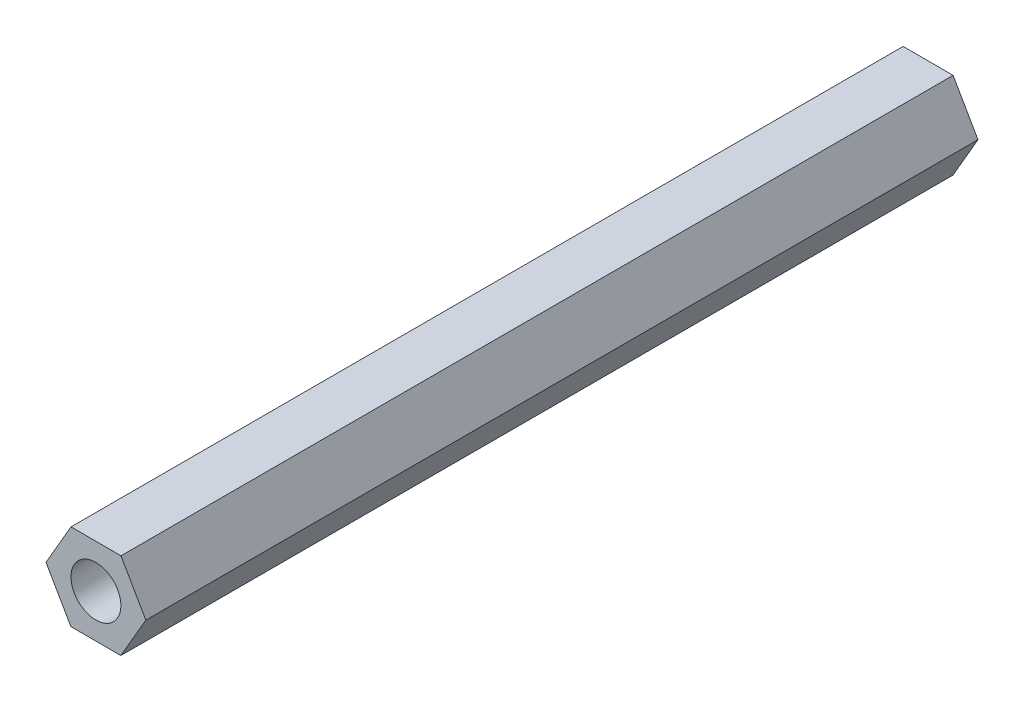
ISO-10303-21;
HEADER;
FILE_DESCRIPTION(('STEP AP214'),'2;1');
FILE_NAME('part.step','',(''),(''),'','','');
FILE_SCHEMA(('AUTOMOTIVE_DESIGN { 1 0 10303 214 1 1 1 1 }'));
ENDSEC;
DATA;
#1=APPLICATION_CONTEXT('core data for automotive mechanical design processes');
#2=APPLICATION_PROTOCOL_DEFINITION('international standard','automotive_design',2000,#1);
#3=PRODUCT_CONTEXT('',#1,'mechanical');
#4=PRODUCT('Part','Part','',(#3));
#5=PRODUCT_RELATED_PRODUCT_CATEGORY('part','',(#4));
#6=PRODUCT_DEFINITION_FORMATION('','',#4);
#7=PRODUCT_DEFINITION_CONTEXT('part definition',#1,'design');
#8=PRODUCT_DEFINITION('design','',#6,#7);
#9=PRODUCT_DEFINITION_SHAPE('','',#8);
#10=(LENGTH_UNIT() NAMED_UNIT(*) SI_UNIT(.MILLI.,.METRE.));
#11=(NAMED_UNIT(*) PLANE_ANGLE_UNIT() SI_UNIT($,.RADIAN.));
#12=(NAMED_UNIT(*) SI_UNIT($,.STERADIAN.) SOLID_ANGLE_UNIT());
#13=UNCERTAINTY_MEASURE_WITH_UNIT(LENGTH_MEASURE(1.E-05),#10,'distance_accuracy_value','');
#14=(GEOMETRIC_REPRESENTATION_CONTEXT(3) GLOBAL_UNCERTAINTY_ASSIGNED_CONTEXT((#13)) GLOBAL_UNIT_ASSIGNED_CONTEXT((#10,
#11,#12)) REPRESENTATION_CONTEXT('',''));
#15=CARTESIAN_POINT('',(0.,0.,0.));
#16=DIRECTION('',(0.,0.,1.));
#17=DIRECTION('',(1.,0.,0.));
#18=AXIS2_PLACEMENT_3D('',#15,#16,#17);
#19=CARTESIAN_POINT('',(2.5,0.,50.));
#20=DIRECTION('',(0.,0.,1.));
#21=DIRECTION('',(1.,0.,0.));
#22=AXIS2_PLACEMENT_3D('',#19,#20,#21);
#23=PLANE('',#22);
#24=CARTESIAN_POINT('',(0.,0.,50.));
#25=DIRECTION('',(0.,0.,-1.));
#26=DIRECTION('',(-1.,0.,0.));
#27=AXIS2_PLACEMENT_3D('',#24,#25,#26);
#28=CIRCLE('',#27,1.5);
#29=CARTESIAN_POINT('',(-1.5,0.,50.));
#30=VERTEX_POINT('',#29);
#31=EDGE_CURVE('E11',#30,#30,#28,.T.);
#32=ORIENTED_EDGE('',*,*,#31,.T.);
#33=EDGE_LOOP('',(#32));
#34=FACE_BOUND('',#33,.T.);
#35=DIRECTION('',(0.999998664474755,-0.00163433433127888,0.));
#36=VECTOR('',#35,1.);
#37=CARTESIAN_POINT('',(-1.49575187156464,2.60052424305387,50.));
#38=LINE('',#37,#36);
#39=CARTESIAN_POINT('',(-1.49575187156464,2.60052424305387,50.));
#40=VERTEX_POINT('',#39);
#41=CARTESIAN_POINT('',(1.50424412185963,2.59562124006003,50.));
#42=VERTEX_POINT('',#41);
#43=EDGE_CURVE('E137',#40,#42,#38,.T.);
#44=ORIENTED_EDGE('',*,*,#43,.F.);
#45=DIRECTION('',(0.501414707286542,0.86520708002001,0.));
#46=VECTOR('',#45,1.);
#47=CARTESIAN_POINT('',(-2.99999599342427,0.00490300299383771,50.));
#48=LINE('',#47,#46);
#49=CARTESIAN_POINT('',(-2.99999599342427,0.00490300299383771,50.));
#50=VERTEX_POINT('',#49);
#51=EDGE_CURVE('E112',#50,#40,#48,.T.);
#52=ORIENTED_EDGE('',*,*,#51,.F.);
#53=DIRECTION('',(-0.498583957188213,0.866841414351289,0.));
#54=VECTOR('',#53,1.);
#55=CARTESIAN_POINT('',(-1.50424412185963,-2.59562124006003,50.));
#56=LINE('',#55,#54);
#57=CARTESIAN_POINT('',(-1.50424412185963,-2.59562124006003,50.));
#58=VERTEX_POINT('',#57);
#59=EDGE_CURVE('E98',#58,#50,#56,.T.);
#60=ORIENTED_EDGE('',*,*,#59,.F.);
#61=DIRECTION('',(-0.999998664474755,0.00163433433127902,0.));
#62=VECTOR('',#61,1.);
#63=CARTESIAN_POINT('',(1.49575187156464,-2.60052424305387,50.));
#64=LINE('',#63,#62);
#65=CARTESIAN_POINT('',(1.49575187156464,-2.60052424305387,50.));
#66=VERTEX_POINT('',#65);
#67=EDGE_CURVE('E110',#66,#58,#64,.T.);
#68=ORIENTED_EDGE('',*,*,#67,.F.);
#69=DIRECTION('',(-0.501414707286542,-0.865207080020009,0.));
#70=VECTOR('',#69,1.);
#71=CARTESIAN_POINT('',(2.99999599342427,-0.00490300299383881,50.));
#72=LINE('',#71,#70);
#73=CARTESIAN_POINT('',(2.99999599342427,-0.00490300299383881,50.));
#74=VERTEX_POINT('',#73);
#75=EDGE_CURVE('E115',#74,#66,#72,.T.);
#76=ORIENTED_EDGE('',*,*,#75,.F.);
#77=DIRECTION('',(0.498583957188213,-0.866841414351289,0.));
#78=VECTOR('',#77,1.);
#79=CARTESIAN_POINT('',(1.50424412185963,2.59562124006003,50.));
#80=LINE('',#79,#78);
#81=EDGE_CURVE('E117',#42,#74,#80,.T.);
#82=ORIENTED_EDGE('',*,*,#81,.F.);
#83=EDGE_LOOP('',(#44,#52,#60,#68,#76,#82));
#84=FACE_BOUND('',#83,.T.);
#85=ADVANCED_FACE('F36',(#34,#84),#23,.T.);
#86=CARTESIAN_POINT('',(0.,0.,50.));
#87=DIRECTION('',(0.,0.,-1.));
#88=DIRECTION('',(-1.,0.,0.));
#89=AXIS2_PLACEMENT_3D('',#86,#87,#88);
#90=CYLINDRICAL_SURFACE('',#89,1.5);
#91=CARTESIAN_POINT('',(0.,0.,0.));
#92=DIRECTION('',(0.,0.,-1.));
#93=DIRECTION('',(-1.,0.,0.));
#94=AXIS2_PLACEMENT_3D('',#91,#92,#93);
#95=CIRCLE('',#94,1.5);
#96=CARTESIAN_POINT('',(-1.5,0.,0.));
#97=VERTEX_POINT('',#96);
#98=EDGE_CURVE('E44',#97,#97,#95,.T.);
#99=ORIENTED_EDGE('',*,*,#98,.T.);
#100=EDGE_LOOP('',(#99));
#101=FACE_BOUND('',#100,.T.);
#102=ORIENTED_EDGE('',*,*,#31,.F.);
#103=EDGE_LOOP('',(#102));
#104=FACE_BOUND('',#103,.T.);
#105=ADVANCED_FACE('F146',(#101,#104),#90,.F.);
#106=CARTESIAN_POINT('',(1.5,0.,0.));
#107=DIRECTION('',(0.,0.,-1.));
#108=DIRECTION('',(-1.,0.,0.));
#109=AXIS2_PLACEMENT_3D('',#106,#107,#108);
#110=PLANE('',#109);
#111=ORIENTED_EDGE('',*,*,#98,.F.);
#112=EDGE_LOOP('',(#111));
#113=FACE_BOUND('',#112,.T.);
#114=DIRECTION('',(0.999998664474755,-0.00163433433127888,0.));
#115=VECTOR('',#114,1.);
#116=CARTESIAN_POINT('',(-1.49575187156464,2.60052424305387,0.));
#117=LINE('',#116,#115);
#118=CARTESIAN_POINT('',(-1.49575187156464,2.60052424305387,0.));
#119=VERTEX_POINT('',#118);
#120=CARTESIAN_POINT('',(1.50424412185963,2.59562124006003,0.));
#121=VERTEX_POINT('',#120);
#122=EDGE_CURVE('E122',#119,#121,#117,.T.);
#123=ORIENTED_EDGE('',*,*,#122,.T.);
#124=DIRECTION('',(0.498583957188213,-0.866841414351289,0.));
#125=VECTOR('',#124,1.);
#126=CARTESIAN_POINT('',(1.50424412185963,2.59562124006003,0.));
#127=LINE('',#126,#125);
#128=CARTESIAN_POINT('',(2.99999599342427,-0.00490300299383881,0.));
#129=VERTEX_POINT('',#128);
#130=EDGE_CURVE('E125',#121,#129,#127,.T.);
#131=ORIENTED_EDGE('',*,*,#130,.T.);
#132=DIRECTION('',(-0.501414707286542,-0.865207080020009,0.));
#133=VECTOR('',#132,1.);
#134=CARTESIAN_POINT('',(2.99999599342427,-0.00490300299383881,0.));
#135=LINE('',#134,#133);
#136=CARTESIAN_POINT('',(1.49575187156464,-2.60052424305387,0.));
#137=VERTEX_POINT('',#136);
#138=EDGE_CURVE('E128',#129,#137,#135,.T.);
#139=ORIENTED_EDGE('',*,*,#138,.T.);
#140=DIRECTION('',(-0.999998664474755,0.00163433433127902,0.));
#141=VECTOR('',#140,1.);
#142=CARTESIAN_POINT('',(1.49575187156464,-2.60052424305387,0.));
#143=LINE('',#142,#141);
#144=CARTESIAN_POINT('',(-1.50424412185963,-2.59562124006003,0.));
#145=VERTEX_POINT('',#144);
#146=EDGE_CURVE('E131',#137,#145,#143,.T.);
#147=ORIENTED_EDGE('',*,*,#146,.T.);
#148=DIRECTION('',(-0.498583957188213,0.866841414351289,0.));
#149=VECTOR('',#148,1.);
#150=CARTESIAN_POINT('',(-1.50424412185963,-2.59562124006003,0.));
#151=LINE('',#150,#149);
#152=CARTESIAN_POINT('',(-2.99999599342427,0.00490300299383771,0.));
#153=VERTEX_POINT('',#152);
#154=EDGE_CURVE('E100',#145,#153,#151,.T.);
#155=ORIENTED_EDGE('',*,*,#154,.T.);
#156=DIRECTION('',(0.501414707286542,0.86520708002001,0.));
#157=VECTOR('',#156,1.);
#158=CARTESIAN_POINT('',(-2.99999599342427,0.00490300299383771,0.));
#159=LINE('',#158,#157);
#160=EDGE_CURVE('E134',#153,#119,#159,.T.);
#161=ORIENTED_EDGE('',*,*,#160,.T.);
#162=EDGE_LOOP('',(#123,#131,#139,#147,#155,#161));
#163=FACE_BOUND('',#162,.T.);
#164=ADVANCED_FACE('F149',(#113,#163),#110,.T.);
#165=CARTESIAN_POINT('',(-1.49575187156464,2.60052424305387,50.));
#166=DIRECTION('',(0.00163433433127888,0.999998664474755,0.));
#167=DIRECTION('',(-0.999998664474755,0.00163433433127888,0.));
#168=AXIS2_PLACEMENT_3D('',#165,#166,#167);
#169=PLANE('',#168);
#170=ORIENTED_EDGE('',*,*,#122,.F.);
#171=DIRECTION('',(0.,0.,-1.));
#172=VECTOR('',#171,1.);
#173=CARTESIAN_POINT('',(-1.49575187156464,2.60052424305387,50.));
#174=LINE('',#173,#172);
#175=EDGE_CURVE('E52',#40,#119,#174,.T.);
#176=ORIENTED_EDGE('',*,*,#175,.F.);
#177=ORIENTED_EDGE('',*,*,#43,.T.);
#178=DIRECTION('',(0.,0.,-1.));
#179=VECTOR('',#178,1.);
#180=CARTESIAN_POINT('',(1.50424412185963,2.59562124006003,50.));
#181=LINE('',#180,#179);
#182=EDGE_CURVE('E87',#42,#121,#181,.T.);
#183=ORIENTED_EDGE('',*,*,#182,.T.);
#184=EDGE_LOOP('',(#170,#176,#177,#183));
#185=FACE_BOUND('',#184,.T.);
#186=ADVANCED_FACE('F152',(#185),#169,.T.);
#187=CARTESIAN_POINT('',(-2.99999599342427,0.00490300299383771,50.));
#188=DIRECTION('',(-0.86520708002001,0.501414707286542,0.));
#189=DIRECTION('',(-0.501414707286542,-0.86520708002001,0.));
#190=AXIS2_PLACEMENT_3D('',#187,#188,#189);
#191=PLANE('',#190);
#192=ORIENTED_EDGE('',*,*,#160,.F.);
#193=DIRECTION('',(0.,0.,-1.));
#194=VECTOR('',#193,1.);
#195=CARTESIAN_POINT('',(-2.99999599342427,0.00490300299383771,50.));
#196=LINE('',#195,#194);
#197=EDGE_CURVE('E75',#50,#153,#196,.T.);
#198=ORIENTED_EDGE('',*,*,#197,.F.);
#199=ORIENTED_EDGE('',*,*,#51,.T.);
#200=ORIENTED_EDGE('',*,*,#175,.T.);
#201=EDGE_LOOP('',(#192,#198,#199,#200));
#202=FACE_BOUND('',#201,.T.);
#203=ADVANCED_FACE('F158',(#202),#191,.T.);
#204=CARTESIAN_POINT('',(-1.50424412185963,-2.59562124006003,50.));
#205=DIRECTION('',(-0.866841414351289,-0.498583957188213,0.));
#206=DIRECTION('',(0.498583957188213,-0.866841414351289,0.));
#207=AXIS2_PLACEMENT_3D('',#204,#205,#206);
#208=PLANE('',#207);
#209=ORIENTED_EDGE('',*,*,#154,.F.);
#210=DIRECTION('',(0.,0.,-1.));
#211=VECTOR('',#210,1.);
#212=CARTESIAN_POINT('',(-1.50424412185963,-2.59562124006003,50.));
#213=LINE('',#212,#211);
#214=EDGE_CURVE('E95',#58,#145,#213,.T.);
#215=ORIENTED_EDGE('',*,*,#214,.F.);
#216=ORIENTED_EDGE('',*,*,#59,.T.);
#217=ORIENTED_EDGE('',*,*,#197,.T.);
#218=EDGE_LOOP('',(#209,#215,#216,#217));
#219=FACE_BOUND('',#218,.T.);
#220=ADVANCED_FACE('F97',(#219),#208,.T.);
#221=CARTESIAN_POINT('',(1.49575187156464,-2.60052424305387,50.));
#222=DIRECTION('',(-0.00163433433127902,-0.999998664474755,0.));
#223=DIRECTION('',(0.999998664474755,-0.00163433433127902,0.));
#224=AXIS2_PLACEMENT_3D('',#221,#222,#223);
#225=PLANE('',#224);
#226=ORIENTED_EDGE('',*,*,#146,.F.);
#227=DIRECTION('',(0.,0.,-1.));
#228=VECTOR('',#227,1.);
#229=CARTESIAN_POINT('',(1.49575187156464,-2.60052424305387,50.));
#230=LINE('',#229,#228);
#231=EDGE_CURVE('E105',#66,#137,#230,.T.);
#232=ORIENTED_EDGE('',*,*,#231,.F.);
#233=ORIENTED_EDGE('',*,*,#67,.T.);
#234=ORIENTED_EDGE('',*,*,#214,.T.);
#235=EDGE_LOOP('',(#226,#232,#233,#234));
#236=FACE_BOUND('',#235,.T.);
#237=ADVANCED_FACE('F114',(#236),#225,.T.);
#238=CARTESIAN_POINT('',(2.99999599342427,-0.00490300299383881,50.));
#239=DIRECTION('',(0.86520708002001,-0.501414707286542,0.));
#240=DIRECTION('',(0.501414707286542,0.86520708002001,0.));
#241=AXIS2_PLACEMENT_3D('',#238,#239,#240);
#242=PLANE('',#241);
#243=ORIENTED_EDGE('',*,*,#138,.F.);
#244=DIRECTION('',(0.,0.,-1.));
#245=VECTOR('',#244,1.);
#246=CARTESIAN_POINT('',(2.99999599342427,-0.00490300299383881,50.));
#247=LINE('',#246,#245);
#248=EDGE_CURVE('E141',#74,#129,#247,.T.);
#249=ORIENTED_EDGE('',*,*,#248,.F.);
#250=ORIENTED_EDGE('',*,*,#75,.T.);
#251=ORIENTED_EDGE('',*,*,#231,.T.);
#252=EDGE_LOOP('',(#243,#249,#250,#251));
#253=FACE_BOUND('',#252,.T.);
#254=ADVANCED_FACE('F157',(#253),#242,.T.);
#255=CARTESIAN_POINT('',(1.50424412185963,2.59562124006003,50.));
#256=DIRECTION('',(0.866841414351289,0.498583957188213,0.));
#257=DIRECTION('',(-0.498583957188213,0.866841414351289,0.));
#258=AXIS2_PLACEMENT_3D('',#255,#256,#257);
#259=PLANE('',#258);
#260=ORIENTED_EDGE('',*,*,#130,.F.);
#261=ORIENTED_EDGE('',*,*,#182,.F.);
#262=ORIENTED_EDGE('',*,*,#81,.T.);
#263=ORIENTED_EDGE('',*,*,#248,.T.);
#264=EDGE_LOOP('',(#260,#261,#262,#263));
#265=FACE_BOUND('',#264,.T.);
#266=ADVANCED_FACE('F154',(#265),#259,.T.);
#267=CLOSED_SHELL('',(#85,#105,#164,#186,#203,#220,#237,#254,#266));
#268=MANIFOLD_SOLID_BREP('B2',#267);
#269=ADVANCED_BREP_SHAPE_REPRESENTATION('',(#18,#268),#14);
#270=SHAPE_DEFINITION_REPRESENTATION(#9,#269);
ENDSEC;
END-ISO-10303-21;
